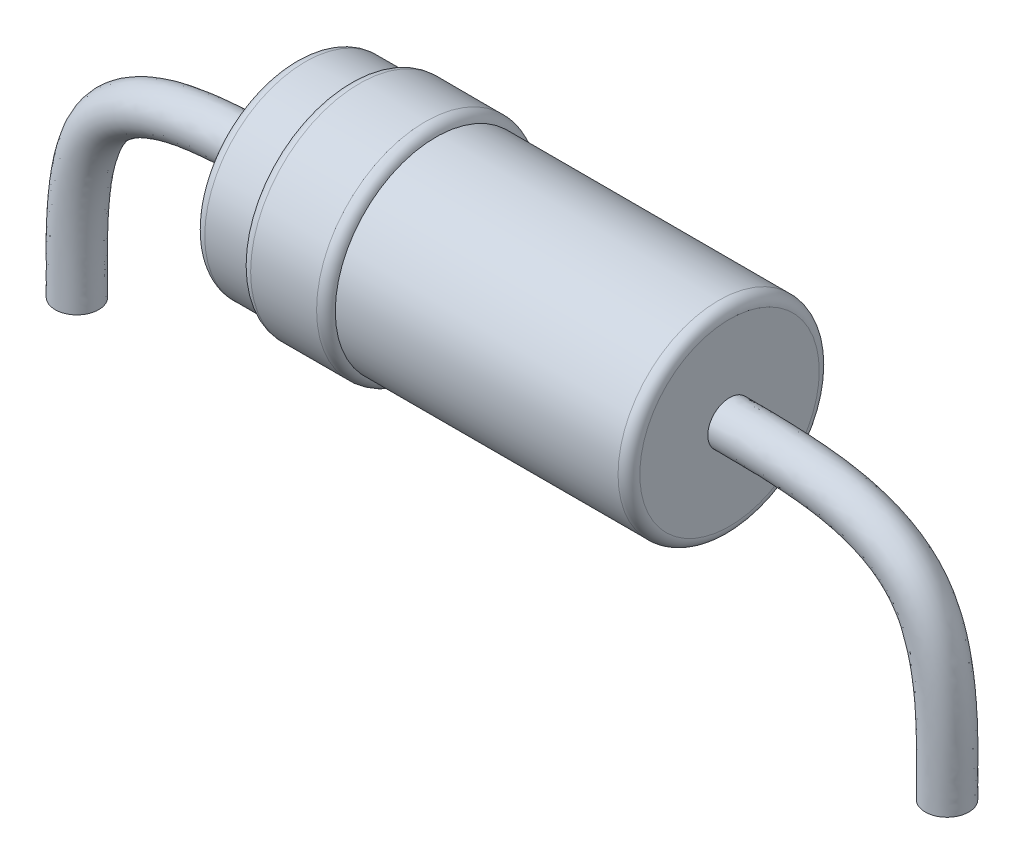
ISO-10303-21;
HEADER;
FILE_DESCRIPTION(('STEP AP214'),'2;1');
FILE_NAME('part.step','',(''),(''),'','','');
FILE_SCHEMA(('AUTOMOTIVE_DESIGN { 1 0 10303 214 1 1 1 1 }'));
ENDSEC;
DATA;
#1=APPLICATION_CONTEXT('core data for automotive mechanical design processes');
#2=APPLICATION_PROTOCOL_DEFINITION('international standard','automotive_design',2000,#1);
#3=PRODUCT_CONTEXT('',#1,'mechanical');
#4=PRODUCT('Part','Part','',(#3));
#5=PRODUCT_RELATED_PRODUCT_CATEGORY('part','',(#4));
#6=PRODUCT_DEFINITION_FORMATION('','',#4);
#7=PRODUCT_DEFINITION_CONTEXT('part definition',#1,'design');
#8=PRODUCT_DEFINITION('design','',#6,#7);
#9=PRODUCT_DEFINITION_SHAPE('','',#8);
#10=(LENGTH_UNIT() NAMED_UNIT(*) SI_UNIT(.MILLI.,.METRE.));
#11=(NAMED_UNIT(*) PLANE_ANGLE_UNIT() SI_UNIT($,.RADIAN.));
#12=(NAMED_UNIT(*) SI_UNIT($,.STERADIAN.) SOLID_ANGLE_UNIT());
#13=UNCERTAINTY_MEASURE_WITH_UNIT(LENGTH_MEASURE(1.E-05),#10,'distance_accuracy_value','');
#14=(GEOMETRIC_REPRESENTATION_CONTEXT(3) GLOBAL_UNCERTAINTY_ASSIGNED_CONTEXT((#13)) GLOBAL_UNIT_ASSIGNED_CONTEXT((#10,
#11,#12)) REPRESENTATION_CONTEXT('',''));
#15=CARTESIAN_POINT('',(0.,0.,0.));
#16=DIRECTION('',(0.,0.,1.));
#17=DIRECTION('',(1.,0.,0.));
#18=AXIS2_PLACEMENT_3D('',#15,#16,#17);
#19=CARTESIAN_POINT('',(2.,1.5,0.));
#20=DIRECTION('',(1.,0.,0.));
#21=DIRECTION('',(0.,0.,-1.));
#22=AXIS2_PLACEMENT_3D('',#19,#20,#21);
#23=PLANE('',#22);
#24=CARTESIAN_POINT('',(2.,1.5,0.));
#25=DIRECTION('',(1.,0.,0.));
#26=DIRECTION('',(0.,0.,-1.));
#27=AXIS2_PLACEMENT_3D('',#24,#25,#26);
#28=CIRCLE('',#27,0.2);
#29=CARTESIAN_POINT('',(2.,1.5,-0.2));
#30=VERTEX_POINT('',#29);
#31=EDGE_CURVE('E55',#30,#30,#28,.T.);
#32=ORIENTED_EDGE('',*,*,#31,.F.);
#33=EDGE_LOOP('',(#32));
#34=FACE_BOUND('',#33,.T.);
#35=ADVANCED_FACE('F48',(#34),#23,.F.);
#36=CARTESIAN_POINT('',(4.,-0.5,0.));
#37=DIRECTION('',(0.,-1.,0.));
#38=DIRECTION('',(0.,0.,-1.));
#39=AXIS2_PLACEMENT_3D('',#36,#37,#38);
#40=PLANE('',#39);
#41=CARTESIAN_POINT('',(4.,-0.5,0.));
#42=DIRECTION('',(0.,-1.,0.));
#43=DIRECTION('',(0.,0.,-1.));
#44=AXIS2_PLACEMENT_3D('',#41,#42,#43);
#45=CIRCLE('',#44,0.2);
#46=CARTESIAN_POINT('',(4.,-0.5,-0.2));
#47=VERTEX_POINT('',#46);
#48=EDGE_CURVE('E12',#47,#47,#45,.T.);
#49=ORIENTED_EDGE('',*,*,#48,.T.);
#50=EDGE_LOOP('',(#49));
#51=FACE_BOUND('',#50,.T.);
#52=ADVANCED_FACE('F62',(#51),#40,.T.);
#53=CARTESIAN_POINT('',(2.,1.5,-0.2));
#54=CARTESIAN_POINT('',(2.31636674535084,1.50000004228049,-0.2));
#55=CARTESIAN_POINT('',(2.71003739377316,1.49641961589019,-0.2));
#56=CARTESIAN_POINT('',(3.34771686303986,1.36783819660981,-0.2));
#57=CARTESIAN_POINT('',(3.59118115209427,1.24219356530228,-0.2));
#58=CARTESIAN_POINT('',(3.89151188763433,0.851556434697721,-0.2));
#59=CARTESIAN_POINT('',(3.95616994109345,0.577594564348136,-0.2));
#60=CARTESIAN_POINT('',(4.01041668887263,0.0145642274743431,-0.2));
#61=CARTESIAN_POINT('',(4.00000006985767,-0.274498201869331,-0.2));
#62=CARTESIAN_POINT('',(4.,-0.5,-0.2));
#63=CARTESIAN_POINT('',(2.,1.9,-0.2));
#64=CARTESIAN_POINT('',(2.31938497710314,1.90000004342834,-0.2));
#65=CARTESIAN_POINT('',(2.72910082706989,1.90062645144074,-0.2));
#66=CARTESIAN_POINT('',(3.48678151212559,1.74784785512327,-0.2));
#67=CARTESIAN_POINT('',(3.83174065851691,1.58556732488768,-0.2));
#68=CARTESIAN_POINT('',(4.28517758329712,0.995787425950223,-0.2));
#69=CARTESIAN_POINT('',(4.35088176416337,0.651705859469844,-0.2));
#70=CARTESIAN_POINT('',(4.41201736469923,0.017175837023759,-0.2));
#71=CARTESIAN_POINT('',(4.40000005573841,-0.286816311062715,-0.2));
#72=CARTESIAN_POINT('',(4.4,-0.5,-0.2));
#73=CARTESIAN_POINT('',(2.,1.9,0.2));
#74=CARTESIAN_POINT('',(2.31938497710314,1.90000004342834,0.2));
#75=CARTESIAN_POINT('',(2.72910082706989,1.90062645144074,0.2));
#76=CARTESIAN_POINT('',(3.48678151212559,1.74784785512327,0.2));
#77=CARTESIAN_POINT('',(3.83174065851691,1.58556732488768,0.2));
#78=CARTESIAN_POINT('',(4.28517758329712,0.995787425950223,0.2));
#79=CARTESIAN_POINT('',(4.35088176416337,0.651705859469844,0.2));
#80=CARTESIAN_POINT('',(4.41201736469923,0.017175837023759,0.2));
#81=CARTESIAN_POINT('',(4.40000005573841,-0.286816311062715,0.2));
#82=CARTESIAN_POINT('',(4.4,-0.5,0.2));
#83=CARTESIAN_POINT('',(2.,1.5,0.2));
#84=CARTESIAN_POINT('',(2.31636674535084,1.50000004228049,0.2));
#85=CARTESIAN_POINT('',(2.71003739377316,1.49641961589019,0.2));
#86=CARTESIAN_POINT('',(3.34771686303986,1.36783819660981,0.2));
#87=CARTESIAN_POINT('',(3.59118115209427,1.24219356530228,0.2));
#88=CARTESIAN_POINT('',(3.89151188763433,0.851556434697721,0.2));
#89=CARTESIAN_POINT('',(3.95616994109345,0.577594564348136,0.2));
#90=CARTESIAN_POINT('',(4.01041668887263,0.0145642274743431,0.2));
#91=CARTESIAN_POINT('',(4.00000006985767,-0.274498201869331,0.2));
#92=CARTESIAN_POINT('',(4.,-0.5,0.2));
#93=CARTESIAN_POINT('',(2.,1.1,0.2));
#94=CARTESIAN_POINT('',(2.31334851359853,1.10000004113264,0.2));
#95=CARTESIAN_POINT('',(2.69097396047644,1.09221278033964,0.2));
#96=CARTESIAN_POINT('',(3.20865221395413,0.98782853809635,0.2));
#97=CARTESIAN_POINT('',(3.35062164567162,0.898819805716874,0.2));
#98=CARTESIAN_POINT('',(3.49784619197155,0.70732544344522,0.2));
#99=CARTESIAN_POINT('',(3.56145811802352,0.503483269226427,0.2));
#100=CARTESIAN_POINT('',(3.60881601304603,0.0119526179249274,0.2));
#101=CARTESIAN_POINT('',(3.60000008397694,-0.262180092675948,0.2));
#102=CARTESIAN_POINT('',(3.6,-0.5,0.2));
#103=CARTESIAN_POINT('',(2.,1.1,-0.2));
#104=CARTESIAN_POINT('',(2.31334851359853,1.10000004113264,-0.2));
#105=CARTESIAN_POINT('',(2.69097396047644,1.09221278033964,-0.2));
#106=CARTESIAN_POINT('',(3.20865221395413,0.98782853809635,-0.2));
#107=CARTESIAN_POINT('',(3.35062164567162,0.898819805716874,-0.2));
#108=CARTESIAN_POINT('',(3.49784619197155,0.70732544344522,-0.2));
#109=CARTESIAN_POINT('',(3.56145811802352,0.503483269226427,-0.2));
#110=CARTESIAN_POINT('',(3.60881601304603,0.0119526179249274,-0.2));
#111=CARTESIAN_POINT('',(3.60000008397694,-0.262180092675948,-0.2));
#112=CARTESIAN_POINT('',(3.6,-0.5,-0.2));
#113=CARTESIAN_POINT('',(2.,1.5,-0.2));
#114=CARTESIAN_POINT('',(2.31636674535084,1.50000004228049,-0.2));
#115=CARTESIAN_POINT('',(2.71003739377316,1.49641961589019,-0.2));
#116=CARTESIAN_POINT('',(3.34771686303986,1.36783819660981,-0.2));
#117=CARTESIAN_POINT('',(3.59118115209427,1.24219356530228,-0.2));
#118=CARTESIAN_POINT('',(3.89151188763433,0.851556434697721,-0.2));
#119=CARTESIAN_POINT('',(3.95616994109345,0.577594564348136,-0.2));
#120=CARTESIAN_POINT('',(4.01041668887263,0.0145642274743431,-0.2));
#121=CARTESIAN_POINT('',(4.00000006985767,-0.274498201869331,-0.2));
#122=CARTESIAN_POINT('',(4.,-0.5,-0.2));
#123=(BOUNDED_SURFACE() B_SPLINE_SURFACE(3,3,((#53,#54,#55,#56,#57,#58,#59,#60,#61,#62),(#63,
#64,#65,#66,#67,#68,#69,#70,#71,#72),(#73,#74,#75,#76,#77,#78,#79,#80,#81,#82),(#83,#84,#85,#86,
#87,#88,#89,#90,#91,#92),(#93,#94,#95,#96,#97,#98,#99,#100,#101,#102),(#103,#104,#105,#106,#107,
#108,#109,#110,#111,#112),(#113,#114,#115,#116,#117,#118,#119,#120,#121,#122)),.UNSPECIFIED.,
.T.,.F.,.F.) B_SPLINE_SURFACE_WITH_KNOTS((4,3,4),(4,2,2,2,4),(0.,0.5,1.),(0.,0.25,0.5,0.75,1.),
.UNSPECIFIED.) GEOMETRIC_REPRESENTATION_ITEM() RATIONAL_B_SPLINE_SURFACE(((1.,1.,1.,1.,1.,1.,1.,
1.,1.,1.),(0.333333333333333,0.333333333333333,0.333333333333333,0.333333333333333,
0.333333333333333,0.333333333333333,0.333333333333333,0.333333333333333,0.333333333333333,
0.333333333333333),(0.333333333333333,0.333333333333333,0.333333333333333,0.333333333333333,
0.333333333333333,0.333333333333333,0.333333333333333,0.333333333333333,0.333333333333333,
0.333333333333333),(1.,1.,1.,1.,1.,1.,1.,1.,1.,1.),(0.333333333333333,0.333333333333333,
0.333333333333333,0.333333333333333,0.333333333333333,0.333333333333333,0.333333333333333,
0.333333333333333,0.333333333333333,0.333333333333333),(0.333333333333333,0.333333333333333,
0.333333333333333,0.333333333333333,0.333333333333333,0.333333333333333,0.333333333333333,
0.333333333333333,0.333333333333333,0.333333333333333),(1.,1.,1.,1.,1.,1.,1.,1.,1.,1.))) REPRESENTATION_ITEM('') SURFACE());
#124=ORIENTED_EDGE('',*,*,#48,.F.);
#125=EDGE_LOOP('',(#124));
#126=FACE_BOUND('',#125,.T.);
#127=ORIENTED_EDGE('',*,*,#31,.T.);
#128=EDGE_LOOP('',(#127));
#129=FACE_BOUND('',#128,.T.);
#130=ADVANCED_FACE('F64',(#126,#129),#123,.T.);
#131=CLOSED_SHELL('',(#35,#52,#130));
#132=MANIFOLD_SOLID_BREP('B2',#131);
#133=CARTESIAN_POINT('',(-2.,1.5,0.));
#134=DIRECTION('',(-1.,0.,0.));
#135=DIRECTION('',(0.,0.,1.));
#136=AXIS2_PLACEMENT_3D('',#133,#134,#135);
#137=PLANE('',#136);
#138=CARTESIAN_POINT('',(-2.,1.5,0.));
#139=DIRECTION('',(-1.,0.,0.));
#140=DIRECTION('',(0.,0.,1.));
#141=AXIS2_PLACEMENT_3D('',#138,#139,#140);
#142=CIRCLE('',#141,0.2);
#143=CARTESIAN_POINT('',(-2.,1.5,0.2));
#144=VERTEX_POINT('',#143);
#145=EDGE_CURVE('E118',#144,#144,#142,.T.);
#146=ORIENTED_EDGE('',*,*,#145,.F.);
#147=EDGE_LOOP('',(#146));
#148=FACE_BOUND('',#147,.T.);
#149=ADVANCED_FACE('F111',(#148),#137,.F.);
#150=CARTESIAN_POINT('',(-4.,-0.5,0.));
#151=DIRECTION('',(0.,-1.,0.));
#152=DIRECTION('',(0.,0.,1.));
#153=AXIS2_PLACEMENT_3D('',#150,#151,#152);
#154=PLANE('',#153);
#155=CARTESIAN_POINT('',(-4.,-0.5,0.));
#156=DIRECTION('',(0.,-1.,0.));
#157=DIRECTION('',(0.,0.,1.));
#158=AXIS2_PLACEMENT_3D('',#155,#156,#157);
#159=CIRCLE('',#158,0.2);
#160=CARTESIAN_POINT('',(-4.,-0.5,0.2));
#161=VERTEX_POINT('',#160);
#162=EDGE_CURVE('E46',#161,#161,#159,.T.);
#163=ORIENTED_EDGE('',*,*,#162,.T.);
#164=EDGE_LOOP('',(#163));
#165=FACE_BOUND('',#164,.T.);
#166=ADVANCED_FACE('F125',(#165),#154,.T.);
#167=CARTESIAN_POINT('',(-2.,1.5,0.2));
#168=CARTESIAN_POINT('',(-2.31636674535084,1.50000004228049,0.2));
#169=CARTESIAN_POINT('',(-2.71003739377316,1.49641961589019,0.2));
#170=CARTESIAN_POINT('',(-3.34771686303986,1.36783819660981,0.2));
#171=CARTESIAN_POINT('',(-3.59118115209427,1.24219356530228,0.2));
#172=CARTESIAN_POINT('',(-3.89151188763433,0.851556434697721,0.2));
#173=CARTESIAN_POINT('',(-3.95616994109345,0.577594564348136,0.2));
#174=CARTESIAN_POINT('',(-4.01041668887263,0.0145642274743431,0.2));
#175=CARTESIAN_POINT('',(-4.00000006985767,-0.274498201869331,0.2));
#176=CARTESIAN_POINT('',(-4.,-0.5,0.2));
#177=CARTESIAN_POINT('',(-2.,1.9,0.2));
#178=CARTESIAN_POINT('',(-2.31938497710314,1.90000004342834,0.2));
#179=CARTESIAN_POINT('',(-2.72910082706989,1.90062645144074,0.2));
#180=CARTESIAN_POINT('',(-3.48678151212559,1.74784785512327,0.2));
#181=CARTESIAN_POINT('',(-3.83174065851691,1.58556732488768,0.2));
#182=CARTESIAN_POINT('',(-4.28517758329712,0.995787425950223,0.2));
#183=CARTESIAN_POINT('',(-4.35088176416337,0.651705859469844,0.2));
#184=CARTESIAN_POINT('',(-4.41201736469923,0.017175837023759,0.2));
#185=CARTESIAN_POINT('',(-4.40000005573841,-0.286816311062715,0.2));
#186=CARTESIAN_POINT('',(-4.4,-0.5,0.2));
#187=CARTESIAN_POINT('',(-2.,1.9,-0.2));
#188=CARTESIAN_POINT('',(-2.31938497710314,1.90000004342834,-0.2));
#189=CARTESIAN_POINT('',(-2.72910082706989,1.90062645144074,-0.2));
#190=CARTESIAN_POINT('',(-3.48678151212559,1.74784785512327,-0.2));
#191=CARTESIAN_POINT('',(-3.83174065851691,1.58556732488768,-0.2));
#192=CARTESIAN_POINT('',(-4.28517758329712,0.995787425950223,-0.2));
#193=CARTESIAN_POINT('',(-4.35088176416337,0.651705859469844,-0.2));
#194=CARTESIAN_POINT('',(-4.41201736469923,0.017175837023759,-0.2));
#195=CARTESIAN_POINT('',(-4.40000005573841,-0.286816311062715,-0.2));
#196=CARTESIAN_POINT('',(-4.4,-0.5,-0.2));
#197=CARTESIAN_POINT('',(-2.,1.5,-0.2));
#198=CARTESIAN_POINT('',(-2.31636674535084,1.50000004228049,-0.2));
#199=CARTESIAN_POINT('',(-2.71003739377316,1.49641961589019,-0.2));
#200=CARTESIAN_POINT('',(-3.34771686303986,1.36783819660981,-0.2));
#201=CARTESIAN_POINT('',(-3.59118115209427,1.24219356530228,-0.2));
#202=CARTESIAN_POINT('',(-3.89151188763433,0.851556434697721,-0.2));
#203=CARTESIAN_POINT('',(-3.95616994109345,0.577594564348136,-0.2));
#204=CARTESIAN_POINT('',(-4.01041668887263,0.0145642274743431,-0.2));
#205=CARTESIAN_POINT('',(-4.00000006985767,-0.274498201869331,-0.2));
#206=CARTESIAN_POINT('',(-4.,-0.5,-0.2));
#207=CARTESIAN_POINT('',(-2.,1.1,-0.2));
#208=CARTESIAN_POINT('',(-2.31334851359853,1.10000004113264,-0.2));
#209=CARTESIAN_POINT('',(-2.69097396047644,1.09221278033964,-0.2));
#210=CARTESIAN_POINT('',(-3.20865221395413,0.98782853809635,-0.2));
#211=CARTESIAN_POINT('',(-3.35062164567162,0.898819805716874,-0.2));
#212=CARTESIAN_POINT('',(-3.49784619197155,0.70732544344522,-0.2));
#213=CARTESIAN_POINT('',(-3.56145811802352,0.503483269226427,-0.2));
#214=CARTESIAN_POINT('',(-3.60881601304603,0.0119526179249274,-0.2));
#215=CARTESIAN_POINT('',(-3.60000008397694,-0.262180092675948,-0.2));
#216=CARTESIAN_POINT('',(-3.6,-0.5,-0.2));
#217=CARTESIAN_POINT('',(-2.,1.1,0.2));
#218=CARTESIAN_POINT('',(-2.31334851359853,1.10000004113264,0.2));
#219=CARTESIAN_POINT('',(-2.69097396047644,1.09221278033964,0.2));
#220=CARTESIAN_POINT('',(-3.20865221395413,0.98782853809635,0.2));
#221=CARTESIAN_POINT('',(-3.35062164567162,0.898819805716874,0.2));
#222=CARTESIAN_POINT('',(-3.49784619197155,0.70732544344522,0.2));
#223=CARTESIAN_POINT('',(-3.56145811802352,0.503483269226427,0.2));
#224=CARTESIAN_POINT('',(-3.60881601304603,0.0119526179249274,0.2));
#225=CARTESIAN_POINT('',(-3.60000008397694,-0.262180092675948,0.2));
#226=CARTESIAN_POINT('',(-3.6,-0.5,0.2));
#227=CARTESIAN_POINT('',(-2.,1.5,0.2));
#228=CARTESIAN_POINT('',(-2.31636674535084,1.50000004228049,0.2));
#229=CARTESIAN_POINT('',(-2.71003739377316,1.49641961589019,0.2));
#230=CARTESIAN_POINT('',(-3.34771686303986,1.36783819660981,0.2));
#231=CARTESIAN_POINT('',(-3.59118115209427,1.24219356530228,0.2));
#232=CARTESIAN_POINT('',(-3.89151188763433,0.851556434697721,0.2));
#233=CARTESIAN_POINT('',(-3.95616994109345,0.577594564348136,0.2));
#234=CARTESIAN_POINT('',(-4.01041668887263,0.0145642274743431,0.2));
#235=CARTESIAN_POINT('',(-4.00000006985767,-0.274498201869331,0.2));
#236=CARTESIAN_POINT('',(-4.,-0.5,0.2));
#237=(BOUNDED_SURFACE() B_SPLINE_SURFACE(3,3,((#167,#168,#169,#170,#171,#172,#173,#174,#175,
#176),(#177,#178,#179,#180,#181,#182,#183,#184,#185,#186),(#187,#188,#189,#190,#191,#192,#193,
#194,#195,#196),(#197,#198,#199,#200,#201,#202,#203,#204,#205,#206),(#207,#208,#209,#210,#211,
#212,#213,#214,#215,#216),(#217,#218,#219,#220,#221,#222,#223,#224,#225,#226),(#227,#228,#229,
#230,#231,#232,#233,#234,#235,#236)),.UNSPECIFIED.,.T.,.F.,.F.) B_SPLINE_SURFACE_WITH_KNOTS((4,
3,4),(4,2,2,2,4),(0.,0.5,1.),(0.,0.25,0.5,0.75,1.),
.UNSPECIFIED.) GEOMETRIC_REPRESENTATION_ITEM() RATIONAL_B_SPLINE_SURFACE(((1.,1.,1.,1.,1.,1.,1.,
1.,1.,1.),(0.333333333333333,0.333333333333333,0.333333333333333,0.333333333333333,
0.333333333333333,0.333333333333333,0.333333333333333,0.333333333333333,0.333333333333333,
0.333333333333333),(0.333333333333333,0.333333333333333,0.333333333333333,0.333333333333333,
0.333333333333333,0.333333333333333,0.333333333333333,0.333333333333333,0.333333333333333,
0.333333333333333),(1.,1.,1.,1.,1.,1.,1.,1.,1.,1.),(0.333333333333333,0.333333333333333,
0.333333333333333,0.333333333333333,0.333333333333333,0.333333333333333,0.333333333333333,
0.333333333333333,0.333333333333333,0.333333333333333),(0.333333333333333,0.333333333333333,
0.333333333333333,0.333333333333333,0.333333333333333,0.333333333333333,0.333333333333333,
0.333333333333333,0.333333333333333,0.333333333333333),(1.,1.,1.,1.,1.,1.,1.,1.,1.,1.))) REPRESENTATION_ITEM('') SURFACE());
#238=ORIENTED_EDGE('',*,*,#162,.F.);
#239=EDGE_LOOP('',(#238));
#240=FACE_BOUND('',#239,.T.);
#241=ORIENTED_EDGE('',*,*,#145,.T.);
#242=EDGE_LOOP('',(#241));
#243=FACE_BOUND('',#242,.T.);
#244=ADVANCED_FACE('F127',(#240,#243),#237,.T.);
#245=CLOSED_SHELL('',(#149,#166,#244));
#246=MANIFOLD_SOLID_BREP('B6',#245);
#247=CARTESIAN_POINT('',(2.,1.5,0.));
#248=DIRECTION('',(-1.,0.,0.));
#249=DIRECTION('',(0.,0.,1.));
#250=AXIS2_PLACEMENT_3D('',#247,#248,#249);
#251=CYLINDRICAL_SURFACE('',#250,0.925);
#252=CARTESIAN_POINT('',(1.9,1.5,0.));
#253=DIRECTION('',(1.,0.,0.));
#254=DIRECTION('',(0.,0.,-1.));
#255=AXIS2_PLACEMENT_3D('',#252,#253,#254);
#256=CIRCLE('',#255,0.925);
#257=CARTESIAN_POINT('',(1.9,1.5,-0.925));
#258=VERTEX_POINT('',#257);
#259=EDGE_CURVE('E172',#258,#258,#256,.F.);
#260=ORIENTED_EDGE('',*,*,#259,.T.);
#261=EDGE_LOOP('',(#260));
#262=FACE_BOUND('',#261,.T.);
#263=CARTESIAN_POINT('',(-0.7,1.5,0.));
#264=DIRECTION('',(-1.,0.,0.));
#265=DIRECTION('',(0.,0.,1.));
#266=AXIS2_PLACEMENT_3D('',#263,#264,#265);
#267=CIRCLE('',#266,0.925);
#268=CARTESIAN_POINT('',(-0.7,1.5,0.925));
#269=VERTEX_POINT('',#268);
#270=EDGE_CURVE('E187',#269,#269,#267,.T.);
#271=ORIENTED_EDGE('',*,*,#270,.F.);
#272=EDGE_LOOP('',(#271));
#273=FACE_BOUND('',#272,.T.);
#274=ADVANCED_FACE('F161',(#262,#273),#251,.T.);
#275=CARTESIAN_POINT('',(2.,1.5,0.));
#276=DIRECTION('',(1.,0.,0.));
#277=DIRECTION('',(0.,0.,-1.));
#278=AXIS2_PLACEMENT_3D('',#275,#276,#277);
#279=PLANE('',#278);
#280=CARTESIAN_POINT('',(2.,1.5,0.));
#281=DIRECTION('',(1.,0.,0.));
#282=DIRECTION('',(0.,0.,-1.));
#283=AXIS2_PLACEMENT_3D('',#280,#281,#282);
#284=CIRCLE('',#283,0.825);
#285=CARTESIAN_POINT('',(2.,1.5,-0.825));
#286=VERTEX_POINT('',#285);
#287=EDGE_CURVE('E176',#286,#286,#284,.T.);
#288=ORIENTED_EDGE('',*,*,#287,.T.);
#289=EDGE_LOOP('',(#288));
#290=FACE_BOUND('',#289,.T.);
#291=ADVANCED_FACE('F209',(#290),#279,.T.);
#292=CARTESIAN_POINT('',(-0.7,1.5,0.));
#293=DIRECTION('',(-1.,0.,0.));
#294=DIRECTION('',(0.,0.,1.));
#295=AXIS2_PLACEMENT_3D('',#292,#293,#294);
#296=CYLINDRICAL_SURFACE('',#295,1.);
#297=CARTESIAN_POINT('',(-1.40317541634481,1.5,0.));
#298=DIRECTION('',(-1.,0.,0.));
#299=DIRECTION('',(0.,0.,1.));
#300=AXIS2_PLACEMENT_3D('',#297,#298,#299);
#301=CIRCLE('',#300,1.);
#302=CARTESIAN_POINT('',(-1.40317541634481,1.5,1.));
#303=VERTEX_POINT('',#302);
#304=EDGE_CURVE('E110',#303,#303,#301,.F.);
#305=ORIENTED_EDGE('',*,*,#304,.T.);
#306=EDGE_LOOP('',(#305));
#307=FACE_BOUND('',#306,.T.);
#308=CARTESIAN_POINT('',(-0.796824583655185,1.5,0.));
#309=DIRECTION('',(1.,0.,0.));
#310=DIRECTION('',(0.,0.,-1.));
#311=AXIS2_PLACEMENT_3D('',#308,#309,#310);
#312=CIRCLE('',#311,1.);
#313=CARTESIAN_POINT('',(-0.796824583655185,1.5,-1.));
#314=VERTEX_POINT('',#313);
#315=EDGE_CURVE('E168',#314,#314,#312,.F.);
#316=ORIENTED_EDGE('',*,*,#315,.T.);
#317=EDGE_LOOP('',(#316));
#318=FACE_BOUND('',#317,.T.);
#319=ADVANCED_FACE('F215',(#307,#318),#296,.T.);
#320=CARTESIAN_POINT('',(-2.,1.5,0.));
#321=DIRECTION('',(1.,0.,0.));
#322=DIRECTION('',(0.,0.,-1.));
#323=AXIS2_PLACEMENT_3D('',#320,#321,#322);
#324=PLANE('',#323);
#325=CARTESIAN_POINT('',(-2.,1.5,0.));
#326=DIRECTION('',(1.,0.,0.));
#327=DIRECTION('',(0.,0.,-1.));
#328=AXIS2_PLACEMENT_3D('',#325,#326,#327);
#329=CIRCLE('',#328,0.825);
#330=CARTESIAN_POINT('',(-2.,1.5,-0.825));
#331=VERTEX_POINT('',#330);
#332=EDGE_CURVE('E181',#331,#331,#329,.F.);
#333=ORIENTED_EDGE('',*,*,#332,.T.);
#334=EDGE_LOOP('',(#333));
#335=FACE_BOUND('',#334,.T.);
#336=ADVANCED_FACE('F222',(#335),#324,.F.);
#337=CARTESIAN_POINT('',(-1.9,1.5,0.));
#338=DIRECTION('',(1.,0.,0.));
#339=DIRECTION('',(0.,0.,-1.));
#340=AXIS2_PLACEMENT_3D('',#337,#338,#339);
#341=CIRCLE('',#340,0.925);
#342=CARTESIAN_POINT('',(-1.9,1.5,-0.925));
#343=VERTEX_POINT('',#342);
#344=EDGE_CURVE('E184',#343,#343,#341,.T.);
#345=ORIENTED_EDGE('',*,*,#344,.T.);
#346=EDGE_LOOP('',(#345));
#347=FACE_BOUND('',#346,.T.);
#348=CARTESIAN_POINT('',(-1.5,1.5,0.));
#349=DIRECTION('',(-1.,0.,0.));
#350=DIRECTION('',(0.,0.,1.));
#351=AXIS2_PLACEMENT_3D('',#348,#349,#350);
#352=CIRCLE('',#351,0.925);
#353=CARTESIAN_POINT('',(-1.5,1.5,0.925));
#354=VERTEX_POINT('',#353);
#355=EDGE_CURVE('E190',#354,#354,#352,.T.);
#356=ORIENTED_EDGE('',*,*,#355,.T.);
#357=EDGE_LOOP('',(#356));
#358=FACE_BOUND('',#357,.T.);
#359=ADVANCED_FACE('F194',(#347,#358),#251,.T.);
#360=CARTESIAN_POINT('',(-1.9,1.5,0.));
#361=DIRECTION('',(1.,0.,0.));
#362=DIRECTION('',(0.,0.,-1.));
#363=AXIS2_PLACEMENT_3D('',#360,#361,#362);
#364=TOROIDAL_SURFACE('',#363,0.825,0.1);
#365=ORIENTED_EDGE('',*,*,#332,.F.);
#366=EDGE_LOOP('',(#365));
#367=FACE_BOUND('',#366,.T.);
#368=ORIENTED_EDGE('',*,*,#344,.F.);
#369=EDGE_LOOP('',(#368));
#370=FACE_BOUND('',#369,.T.);
#371=ADVANCED_FACE('F205',(#367,#370),#364,.T.);
#372=CARTESIAN_POINT('',(1.9,1.5,0.));
#373=DIRECTION('',(1.,0.,0.));
#374=DIRECTION('',(0.,0.,-1.));
#375=AXIS2_PLACEMENT_3D('',#372,#373,#374);
#376=TOROIDAL_SURFACE('',#375,0.825,0.1);
#377=ORIENTED_EDGE('',*,*,#259,.F.);
#378=EDGE_LOOP('',(#377));
#379=FACE_BOUND('',#378,.T.);
#380=ORIENTED_EDGE('',*,*,#287,.F.);
#381=EDGE_LOOP('',(#380));
#382=FACE_BOUND('',#381,.T.);
#383=ADVANCED_FACE('F198',(#379,#382),#376,.T.);
#384=CARTESIAN_POINT('',(-1.40317541634481,1.5,0.));
#385=DIRECTION('',(-1.,0.,0.));
#386=DIRECTION('',(0.,0.,1.));
#387=AXIS2_PLACEMENT_3D('',#384,#385,#386);
#388=TOROIDAL_SURFACE('',#387,0.9,0.1);
#389=ORIENTED_EDGE('',*,*,#304,.F.);
#390=EDGE_LOOP('',(#389));
#391=FACE_BOUND('',#390,.T.);
#392=ORIENTED_EDGE('',*,*,#355,.F.);
#393=EDGE_LOOP('',(#392));
#394=FACE_BOUND('',#393,.T.);
#395=ADVANCED_FACE('F196',(#391,#394),#388,.T.);
#396=CARTESIAN_POINT('',(-0.796824583655185,1.5,0.));
#397=DIRECTION('',(1.,0.,0.));
#398=DIRECTION('',(0.,0.,-1.));
#399=AXIS2_PLACEMENT_3D('',#396,#397,#398);
#400=TOROIDAL_SURFACE('',#399,0.9,0.1);
#401=ORIENTED_EDGE('',*,*,#270,.T.);
#402=EDGE_LOOP('',(#401));
#403=FACE_BOUND('',#402,.T.);
#404=ORIENTED_EDGE('',*,*,#315,.F.);
#405=EDGE_LOOP('',(#404));
#406=FACE_BOUND('',#405,.T.);
#407=ADVANCED_FACE('F163',(#403,#406),#400,.T.);
#408=CLOSED_SHELL('',(#274,#291,#319,#336,#359,#371,#383,#395,#407));
#409=MANIFOLD_SOLID_BREP('B40',#408);
#410=ADVANCED_BREP_SHAPE_REPRESENTATION('',(#18,#132,#246,#409),#14);
#411=SHAPE_DEFINITION_REPRESENTATION(#9,#410);
ENDSEC;
END-ISO-10303-21;
